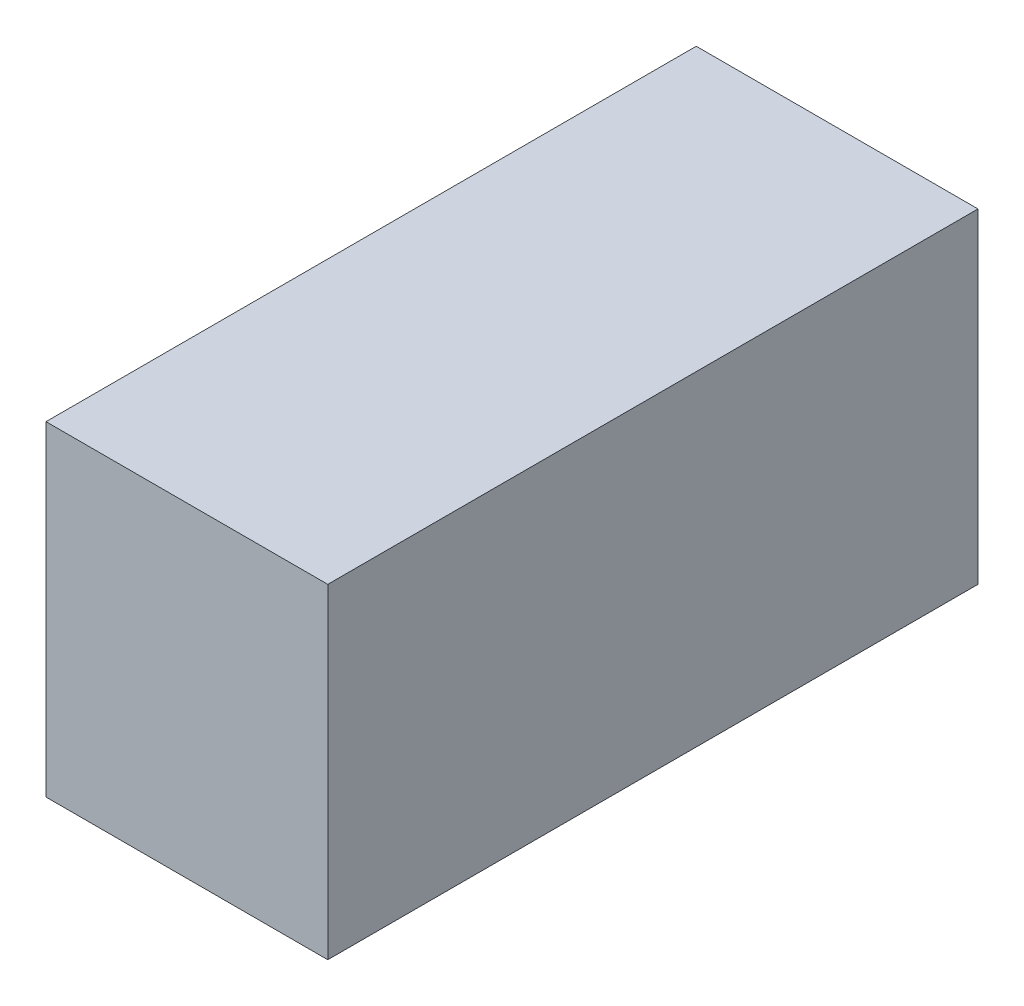
ISO-10303-21;
HEADER;
FILE_DESCRIPTION(('STEP AP214'),'2;1');
FILE_NAME('part.step','',(''),(''),'','','');
FILE_SCHEMA(('AUTOMOTIVE_DESIGN { 1 0 10303 214 1 1 1 1 }'));
ENDSEC;
DATA;
#1=APPLICATION_CONTEXT('core data for automotive mechanical design processes');
#2=APPLICATION_PROTOCOL_DEFINITION('international standard','automotive_design',2000,#1);
#3=PRODUCT_CONTEXT('',#1,'mechanical');
#4=PRODUCT('Part','Part','',(#3));
#5=PRODUCT_RELATED_PRODUCT_CATEGORY('part','',(#4));
#6=PRODUCT_DEFINITION_FORMATION('','',#4);
#7=PRODUCT_DEFINITION_CONTEXT('part definition',#1,'design');
#8=PRODUCT_DEFINITION('design','',#6,#7);
#9=PRODUCT_DEFINITION_SHAPE('','',#8);
#10=(LENGTH_UNIT() NAMED_UNIT(*) SI_UNIT(.MILLI.,.METRE.));
#11=(NAMED_UNIT(*) PLANE_ANGLE_UNIT() SI_UNIT($,.RADIAN.));
#12=(NAMED_UNIT(*) SI_UNIT($,.STERADIAN.) SOLID_ANGLE_UNIT());
#13=UNCERTAINTY_MEASURE_WITH_UNIT(LENGTH_MEASURE(1.E-05),#10,'distance_accuracy_value','');
#14=(GEOMETRIC_REPRESENTATION_CONTEXT(3) GLOBAL_UNCERTAINTY_ASSIGNED_CONTEXT((#13)) GLOBAL_UNIT_ASSIGNED_CONTEXT((#10,
#11,#12)) REPRESENTATION_CONTEXT('',''));
#15=CARTESIAN_POINT('',(0.,0.,0.));
#16=DIRECTION('',(0.,0.,1.));
#17=DIRECTION('',(1.,0.,0.));
#18=AXIS2_PLACEMENT_3D('',#15,#16,#17);
#19=CARTESIAN_POINT('',(-9.67817893858558,15.,-9.05755401051639));
#20=DIRECTION('',(1.,0.,0.));
#21=DIRECTION('',(0.,0.,-1.));
#22=AXIS2_PLACEMENT_3D('',#19,#20,#21);
#23=PLANE('',#22);
#24=DIRECTION('',(0.,0.,1.));
#25=VECTOR('',#24,1.);
#26=CARTESIAN_POINT('',(-9.67817893858558,0.,-9.05755401051639));
#27=LINE('',#26,#25);
#28=CARTESIAN_POINT('',(-9.67817893858558,0.,-9.05755401051639));
#29=VERTEX_POINT('',#28);
#30=CARTESIAN_POINT('',(-9.67817893858558,0.,20.9424459894836));
#31=VERTEX_POINT('',#30);
#32=EDGE_CURVE('E100',#29,#31,#27,.T.);
#33=ORIENTED_EDGE('',*,*,#32,.T.);
#34=DIRECTION('',(0.,-1.,0.));
#35=VECTOR('',#34,1.);
#36=CARTESIAN_POINT('',(-9.67817893858558,15.,20.9424459894836));
#37=LINE('',#36,#35);
#38=CARTESIAN_POINT('',(-9.67817893858558,15.,20.9424459894836));
#39=VERTEX_POINT('',#38);
#40=EDGE_CURVE('E11',#39,#31,#37,.T.);
#41=ORIENTED_EDGE('',*,*,#40,.F.);
#42=DIRECTION('',(0.,0.,1.));
#43=VECTOR('',#42,1.);
#44=CARTESIAN_POINT('',(-9.67817893858558,15.,-9.05755401051639));
#45=LINE('',#44,#43);
#46=CARTESIAN_POINT('',(-9.67817893858558,15.,-9.05755401051639));
#47=VERTEX_POINT('',#46);
#48=EDGE_CURVE('E88',#47,#39,#45,.T.);
#49=ORIENTED_EDGE('',*,*,#48,.F.);
#50=DIRECTION('',(0.,-1.,0.));
#51=VECTOR('',#50,1.);
#52=CARTESIAN_POINT('',(-9.67817893858558,15.,-9.05755401051639));
#53=LINE('',#52,#51);
#54=EDGE_CURVE('E96',#47,#29,#53,.T.);
#55=ORIENTED_EDGE('',*,*,#54,.T.);
#56=EDGE_LOOP('',(#33,#41,#49,#55));
#57=FACE_BOUND('',#56,.T.);
#58=ADVANCED_FACE('F37',(#57),#23,.F.);
#59=CARTESIAN_POINT('',(-9.67817893858558,15.,20.9424459894836));
#60=DIRECTION('',(0.,0.,-1.));
#61=DIRECTION('',(-1.,0.,0.));
#62=AXIS2_PLACEMENT_3D('',#59,#60,#61);
#63=PLANE('',#62);
#64=DIRECTION('',(1.,0.,0.));
#65=VECTOR('',#64,1.);
#66=CARTESIAN_POINT('',(-9.67817893858558,0.,20.9424459894836));
#67=LINE('',#66,#65);
#68=CARTESIAN_POINT('',(3.32182106141442,0.,20.9424459894836));
#69=VERTEX_POINT('',#68);
#70=EDGE_CURVE('E92',#31,#69,#67,.T.);
#71=ORIENTED_EDGE('',*,*,#70,.T.);
#72=DIRECTION('',(0.,-1.,0.));
#73=VECTOR('',#72,1.);
#74=CARTESIAN_POINT('',(3.32182106141442,15.,20.9424459894836));
#75=LINE('',#74,#73);
#76=CARTESIAN_POINT('',(3.32182106141442,15.,20.9424459894836));
#77=VERTEX_POINT('',#76);
#78=EDGE_CURVE('E45',#77,#69,#75,.T.);
#79=ORIENTED_EDGE('',*,*,#78,.F.);
#80=DIRECTION('',(1.,0.,0.));
#81=VECTOR('',#80,1.);
#82=CARTESIAN_POINT('',(-9.67817893858558,15.,20.9424459894836));
#83=LINE('',#82,#81);
#84=EDGE_CURVE('E83',#39,#77,#83,.T.);
#85=ORIENTED_EDGE('',*,*,#84,.F.);
#86=ORIENTED_EDGE('',*,*,#40,.T.);
#87=EDGE_LOOP('',(#71,#79,#85,#86));
#88=FACE_BOUND('',#87,.T.);
#89=ADVANCED_FACE('F91',(#88),#63,.F.);
#90=CARTESIAN_POINT('',(3.32182106141442,15.,-9.05755401051639));
#91=DIRECTION('',(-1.,0.,0.));
#92=DIRECTION('',(0.,0.,1.));
#93=AXIS2_PLACEMENT_3D('',#90,#91,#92);
#94=PLANE('',#93);
#95=DIRECTION('',(0.,0.,-1.));
#96=VECTOR('',#95,1.);
#97=CARTESIAN_POINT('',(3.32182106141442,0.,-9.05755401051639));
#98=LINE('',#97,#96);
#99=CARTESIAN_POINT('',(3.32182106141442,0.,-9.05755401051639));
#100=VERTEX_POINT('',#99);
#101=EDGE_CURVE('E70',#69,#100,#98,.T.);
#102=ORIENTED_EDGE('',*,*,#101,.T.);
#103=DIRECTION('',(0.,-1.,0.));
#104=VECTOR('',#103,1.);
#105=CARTESIAN_POINT('',(3.32182106141442,15.,-9.05755401051639));
#106=LINE('',#105,#104);
#107=CARTESIAN_POINT('',(3.32182106141442,15.,-9.05755401051639));
#108=VERTEX_POINT('',#107);
#109=EDGE_CURVE('E93',#108,#100,#106,.T.);
#110=ORIENTED_EDGE('',*,*,#109,.F.);
#111=DIRECTION('',(0.,0.,-1.));
#112=VECTOR('',#111,1.);
#113=CARTESIAN_POINT('',(3.32182106141442,15.,-9.05755401051639));
#114=LINE('',#113,#112);
#115=EDGE_CURVE('E86',#77,#108,#114,.T.);
#116=ORIENTED_EDGE('',*,*,#115,.F.);
#117=ORIENTED_EDGE('',*,*,#78,.T.);
#118=EDGE_LOOP('',(#102,#110,#116,#117));
#119=FACE_BOUND('',#118,.T.);
#120=ADVANCED_FACE('F94',(#119),#94,.F.);
#121=CARTESIAN_POINT('',(-9.67817893858558,15.,-9.05755401051639));
#122=DIRECTION('',(0.,0.,1.));
#123=DIRECTION('',(1.,0.,0.));
#124=AXIS2_PLACEMENT_3D('',#121,#122,#123);
#125=PLANE('',#124);
#126=DIRECTION('',(-1.,0.,0.));
#127=VECTOR('',#126,1.);
#128=CARTESIAN_POINT('',(-9.67817893858558,0.,-9.05755401051639));
#129=LINE('',#128,#127);
#130=EDGE_CURVE('E76',#100,#29,#129,.T.);
#131=ORIENTED_EDGE('',*,*,#130,.T.);
#132=ORIENTED_EDGE('',*,*,#54,.F.);
#133=DIRECTION('',(-1.,0.,0.));
#134=VECTOR('',#133,1.);
#135=CARTESIAN_POINT('',(-9.67817893858558,15.,-9.05755401051639));
#136=LINE('',#135,#134);
#137=EDGE_CURVE('E53',#108,#47,#136,.T.);
#138=ORIENTED_EDGE('',*,*,#137,.F.);
#139=ORIENTED_EDGE('',*,*,#109,.T.);
#140=EDGE_LOOP('',(#131,#132,#138,#139));
#141=FACE_BOUND('',#140,.T.);
#142=ADVANCED_FACE('F107',(#141),#125,.F.);
#143=CARTESIAN_POINT('',(0.,15.,0.));
#144=DIRECTION('',(0.,1.,0.));
#145=DIRECTION('',(0.,0.,1.));
#146=AXIS2_PLACEMENT_3D('',#143,#144,#145);
#147=PLANE('',#146);
#148=ORIENTED_EDGE('',*,*,#48,.T.);
#149=ORIENTED_EDGE('',*,*,#84,.T.);
#150=ORIENTED_EDGE('',*,*,#115,.T.);
#151=ORIENTED_EDGE('',*,*,#137,.T.);
#152=EDGE_LOOP('',(#148,#149,#150,#151));
#153=FACE_BOUND('',#152,.T.);
#154=ADVANCED_FACE('F84',(#153),#147,.T.);
#155=CARTESIAN_POINT('',(0.,0.,0.));
#156=DIRECTION('',(0.,1.,0.));
#157=DIRECTION('',(0.,0.,1.));
#158=AXIS2_PLACEMENT_3D('',#155,#156,#157);
#159=PLANE('',#158);
#160=ORIENTED_EDGE('',*,*,#32,.F.);
#161=ORIENTED_EDGE('',*,*,#130,.F.);
#162=ORIENTED_EDGE('',*,*,#101,.F.);
#163=ORIENTED_EDGE('',*,*,#70,.F.);
#164=EDGE_LOOP('',(#160,#161,#162,#163));
#165=FACE_BOUND('',#164,.T.);
#166=ADVANCED_FACE('F110',(#165),#159,.F.);
#167=CLOSED_SHELL('',(#58,#89,#120,#142,#154,#166));
#168=MANIFOLD_SOLID_BREP('B2',#167);
#169=ADVANCED_BREP_SHAPE_REPRESENTATION('',(#18,#168),#14);
#170=SHAPE_DEFINITION_REPRESENTATION(#9,#169);
ENDSEC;
END-ISO-10303-21;
